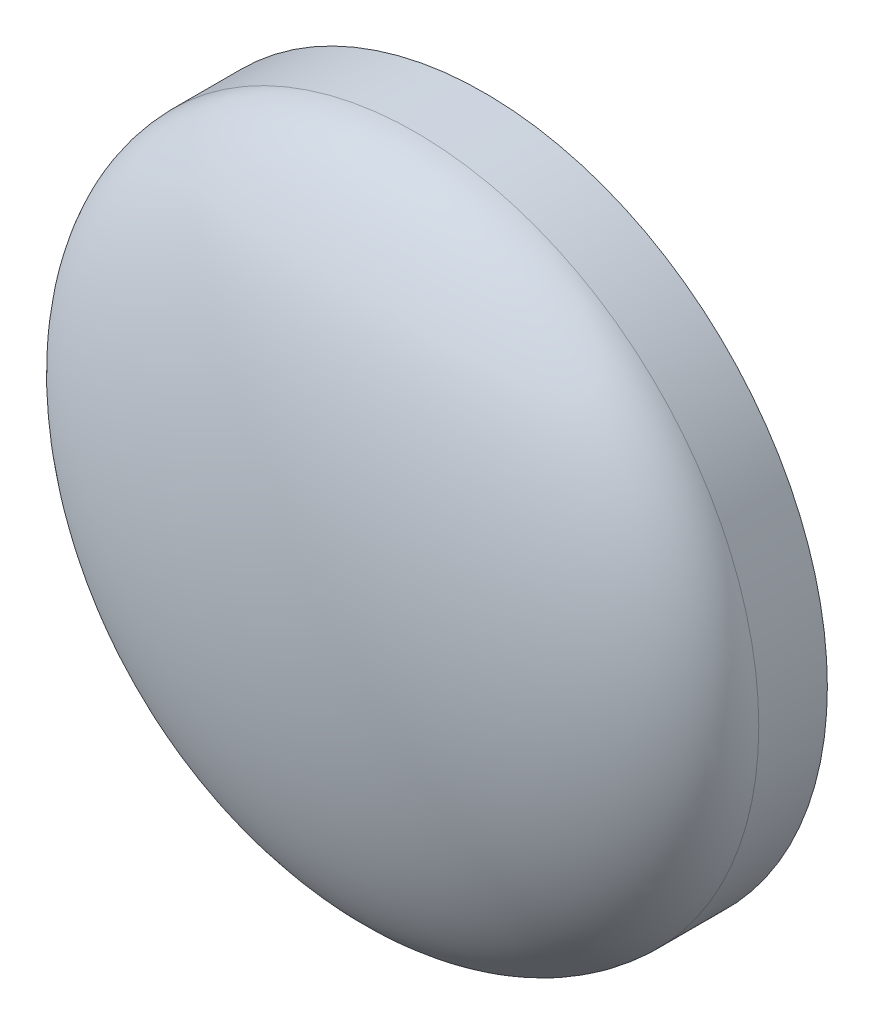
ISO-10303-21;
HEADER;
FILE_DESCRIPTION(('STEP AP214'),'2;1');
FILE_NAME('part.step','',(''),(''),'','','');
FILE_SCHEMA(('AUTOMOTIVE_DESIGN { 1 0 10303 214 1 1 1 1 }'));
ENDSEC;
DATA;
#1=APPLICATION_CONTEXT('core data for automotive mechanical design processes');
#2=APPLICATION_PROTOCOL_DEFINITION('international standard','automotive_design',2000,#1);
#3=PRODUCT_CONTEXT('',#1,'mechanical');
#4=PRODUCT('Part','Part','',(#3));
#5=PRODUCT_RELATED_PRODUCT_CATEGORY('part','',(#4));
#6=PRODUCT_DEFINITION_FORMATION('','',#4);
#7=PRODUCT_DEFINITION_CONTEXT('part definition',#1,'design');
#8=PRODUCT_DEFINITION('design','',#6,#7);
#9=PRODUCT_DEFINITION_SHAPE('','',#8);
#10=(LENGTH_UNIT() NAMED_UNIT(*) SI_UNIT(.MILLI.,.METRE.));
#11=(NAMED_UNIT(*) PLANE_ANGLE_UNIT() SI_UNIT($,.RADIAN.));
#12=(NAMED_UNIT(*) SI_UNIT($,.STERADIAN.) SOLID_ANGLE_UNIT());
#13=UNCERTAINTY_MEASURE_WITH_UNIT(LENGTH_MEASURE(1.E-05),#10,'distance_accuracy_value','');
#14=(GEOMETRIC_REPRESENTATION_CONTEXT(3) GLOBAL_UNCERTAINTY_ASSIGNED_CONTEXT((#13)) GLOBAL_UNIT_ASSIGNED_CONTEXT((#10,
#11,#12)) REPRESENTATION_CONTEXT('',''));
#15=CARTESIAN_POINT('',(0.,0.,0.));
#16=DIRECTION('',(0.,0.,1.));
#17=DIRECTION('',(1.,0.,0.));
#18=AXIS2_PLACEMENT_3D('',#15,#16,#17);
#19=CARTESIAN_POINT('',(3.04657257930898,-1.45705645097387,5.));
#20=DIRECTION('',(0.,0.,-1.));
#21=DIRECTION('',(-1.,0.,0.));
#22=AXIS2_PLACEMENT_3D('',#19,#20,#21);
#23=CYLINDRICAL_SURFACE('',#22,25.);
#24=CARTESIAN_POINT('',(3.04657257930898,-1.45705645097387,5.));
#25=DIRECTION('',(0.,0.,1.));
#26=DIRECTION('',(1.,0.,0.));
#27=AXIS2_PLACEMENT_3D('',#24,#25,#26);
#28=CIRCLE('',#27,25.);
#29=CARTESIAN_POINT('',(28.046572579309,-1.45705645097387,5.));
#30=VERTEX_POINT('',#29);
#31=EDGE_CURVE('E11',#30,#30,#28,.T.);
#32=ORIENTED_EDGE('',*,*,#31,.F.);
#33=EDGE_LOOP('',(#32));
#34=FACE_BOUND('',#33,.T.);
#35=CARTESIAN_POINT('',(3.04657257930898,-1.45705645097387,0.));
#36=DIRECTION('',(0.,0.,1.));
#37=DIRECTION('',(1.,0.,0.));
#38=AXIS2_PLACEMENT_3D('',#35,#36,#37);
#39=CIRCLE('',#38,25.);
#40=CARTESIAN_POINT('',(28.046572579309,-1.45705645097387,0.));
#41=VERTEX_POINT('',#40);
#42=EDGE_CURVE('E44',#41,#41,#39,.T.);
#43=ORIENTED_EDGE('',*,*,#42,.T.);
#44=EDGE_LOOP('',(#43));
#45=FACE_BOUND('',#44,.T.);
#46=ADVANCED_FACE('F35',(#34,#45),#23,.T.);
#47=CARTESIAN_POINT('',(3.04657257930898,-1.45705645097387,5.));
#48=DIRECTION('',(0.,1.,0.));
#49=DIRECTION('',(1.,0.,0.));
#50=AXIS2_PLACEMENT_3D('',#47,#48,#49);
#51=ELLIPSE('',#50,25.,10.);
#52=TRIMMED_CURVE('',#51,(PARAMETER_VALUE(4.71238898038469)),
(PARAMETER_VALUE(7.85398163397448)),.T.,.PARAMETER.);
#53=CARTESIAN_POINT('',(3.04657257930898,-1.45705645097387,-5.));
#54=DIRECTION('',(0.,0.,1.));
#55=AXIS1_PLACEMENT('',#53,#54);
#56=SURFACE_OF_REVOLUTION('',#52,#55);
#57=CARTESIAN_POINT('',(3.04657257930897,-1.45705645097387,15.));
#58=VERTEX_POINT('',#57);
#59=VERTEX_LOOP('',#58);
#60=FACE_BOUND('',#59,.T.);
#61=ORIENTED_EDGE('',*,*,#31,.T.);
#62=EDGE_LOOP('',(#61));
#63=FACE_BOUND('',#62,.T.);
#64=ADVANCED_FACE('F37',(#60,#63),#56,.F.);
#65=CARTESIAN_POINT('',(0.,0.,0.));
#66=DIRECTION('',(0.,0.,1.));
#67=DIRECTION('',(1.,0.,0.));
#68=AXIS2_PLACEMENT_3D('',#65,#66,#67);
#69=PLANE('',#68);
#70=CARTESIAN_POINT('',(3.04657257930898,-1.45705645097387,0.));
#71=DIRECTION('',(0.,0.,1.));
#72=DIRECTION('',(1.,0.,0.));
#73=AXIS2_PLACEMENT_3D('',#70,#71,#72);
#74=CIRCLE('',#73,12.5);
#75=CARTESIAN_POINT('',(15.0712936324435,-4.87115715164202,0.));
#76=VERTEX_POINT('',#75);
#77=CARTESIAN_POINT('',(13.5110028403928,-8.29413911179588,0.));
#78=VERTEX_POINT('',#77);
#79=EDGE_CURVE('E117',#76,#78,#74,.T.);
#80=ORIENTED_EDGE('',*,*,#79,.T.);
#81=CARTESIAN_POINT('',(13.6784337245702,-8.40353243436902,0.));
#82=DIRECTION('',(0.,0.,1.));
#83=DIRECTION('',(1.,0.,0.));
#84=AXIS2_PLACEMENT_3D('',#81,#82,#83);
#85=CIRCLE('',#84,0.2);
#86=CARTESIAN_POINT('',(13.7634029171983,-8.22247930320546,0.));
#87=VERTEX_POINT('',#86);
#88=EDGE_CURVE('E54',#87,#78,#85,.T.);
#89=ORIENTED_EDGE('',*,*,#88,.F.);
#90=DIRECTION('',(-0.905265655817804,0.424845963140478,0.));
#91=VECTOR('',#90,1.);
#92=CARTESIAN_POINT('',(-0.678139954991644,-1.44498680546195,0.));
#93=LINE('',#92,#91);
#94=CARTESIAN_POINT('',(17.087320204919,-9.782411277235,0.));
#95=VERTEX_POINT('',#94);
#96=EDGE_CURVE('E108',#95,#87,#93,.T.);
#97=ORIENTED_EDGE('',*,*,#96,.F.);
#98=CARTESIAN_POINT('',(17.2997431864892,-9.3297784493261,0.));
#99=DIRECTION('',(0.,0.,1.));
#100=DIRECTION('',(1.,0.,0.));
#101=AXIS2_PLACEMENT_3D('',#98,#99,#100);
#102=CIRCLE('',#101,0.499999999999996);
#103=CARTESIAN_POINT('',(17.7374163346552,-9.57152669725053,0.));
#104=VERTEX_POINT('',#103);
#105=EDGE_CURVE('E138',#95,#104,#102,.T.);
#106=ORIENTED_EDGE('',*,*,#105,.T.);
#107=CARTESIAN_POINT('',(3.04657257930898,-1.45705645097387,0.));
#108=DIRECTION('',(0.,0.,1.));
#109=DIRECTION('',(1.,0.,0.));
#110=AXIS2_PLACEMENT_3D('',#107,#108,#109);
#111=CIRCLE('',#110,16.7828936009766);
#112=CARTESIAN_POINT('',(18.793687385888,-7.26170053051246,0.));
#113=VERTEX_POINT('',#112);
#114=EDGE_CURVE('E141',#113,#104,#111,.F.);
#115=ORIENTED_EDGE('',*,*,#114,.F.);
#116=CARTESIAN_POINT('',(18.3245455566845,-7.08876717892401,0.));
#117=DIRECTION('',(0.,0.,1.));
#118=DIRECTION('',(1.,0.,0.));
#119=AXIS2_PLACEMENT_3D('',#116,#117,#118);
#120=CIRCLE('',#119,0.499999999999998);
#121=CARTESIAN_POINT('',(18.5317581742175,-6.63372549826705,0.));
#122=VERTEX_POINT('',#121);
#123=EDGE_CURVE('E144',#113,#122,#120,.T.);
#124=ORIENTED_EDGE('',*,*,#123,.T.);
#125=DIRECTION('',(-0.910083361313929,0.414425235066037,0.));
#126=VECTOR('',#125,1.);
#127=CARTESIAN_POINT('',(0.680811575552799,1.4950713293359,0.));
#128=LINE('',#127,#126);
#129=CARTESIAN_POINT('',(15.1808041222805,-5.10779943511549,0.));
#130=VERTEX_POINT('',#129);
#131=EDGE_CURVE('E147',#122,#130,#128,.T.);
#132=ORIENTED_EDGE('',*,*,#131,.T.);
#133=CARTESIAN_POINT('',(15.2636891692937,-4.9257827628527,0.));
#134=DIRECTION('',(0.,0.,1.));
#135=DIRECTION('',(1.,0.,0.));
#136=AXIS2_PLACEMENT_3D('',#133,#134,#135);
#137=CIRCLE('',#136,0.200000000000001);
#138=EDGE_CURVE('E150',#130,#76,#137,.F.);
#139=ORIENTED_EDGE('',*,*,#138,.T.);
#140=EDGE_LOOP('',(#80,#89,#97,#106,#115,#124,#132,#139));
#141=FACE_BOUND('',#140,.T.);
#142=ORIENTED_EDGE('',*,*,#42,.F.);
#143=EDGE_LOOP('',(#142));
#144=FACE_BOUND('',#143,.T.);
#145=ADVANCED_FACE('F171',(#141,#144),#69,.F.);
#146=CARTESIAN_POINT('',(13.6784337245702,-8.40353243436902,3.));
#147=DIRECTION('',(0.,0.,-1.));
#148=DIRECTION('',(-1.,0.,0.));
#149=AXIS2_PLACEMENT_3D('',#146,#147,#148);
#150=CYLINDRICAL_SURFACE('',#149,0.2);
#151=ORIENTED_EDGE('',*,*,#88,.T.);
#152=DIRECTION('',(0.,0.,-1.));
#153=VECTOR('',#152,1.);
#154=CARTESIAN_POINT('',(13.5110028403928,-8.29413911179588,3.));
#155=LINE('',#154,#153);
#156=CARTESIAN_POINT('',(13.5110028403928,-8.29413911179588,3.));
#157=VERTEX_POINT('',#156);
#158=EDGE_CURVE('E114',#157,#78,#155,.T.);
#159=ORIENTED_EDGE('',*,*,#158,.F.);
#160=CARTESIAN_POINT('',(13.6784337245702,-8.40353243436902,3.));
#161=DIRECTION('',(0.,0.,1.));
#162=DIRECTION('',(1.,0.,0.));
#163=AXIS2_PLACEMENT_3D('',#160,#161,#162);
#164=CIRCLE('',#163,0.2);
#165=CARTESIAN_POINT('',(13.7634029171983,-8.22247930320546,3.));
#166=VERTEX_POINT('',#165);
#167=EDGE_CURVE('E112',#166,#157,#164,.T.);
#168=ORIENTED_EDGE('',*,*,#167,.F.);
#169=DIRECTION('',(0.,0.,-1.));
#170=VECTOR('',#169,1.);
#171=CARTESIAN_POINT('',(13.7634029171983,-8.22247930320546,3.));
#172=LINE('',#171,#170);
#173=EDGE_CURVE('E102',#166,#87,#172,.T.);
#174=ORIENTED_EDGE('',*,*,#173,.T.);
#175=EDGE_LOOP('',(#151,#159,#168,#174));
#176=FACE_BOUND('',#175,.T.);
#177=ADVANCED_FACE('F113',(#176),#150,.T.);
#178=CARTESIAN_POINT('',(-0.678139954991644,-1.44498680546195,3.));
#179=DIRECTION('',(-0.424845963140478,-0.905265655817804,0.));
#180=DIRECTION('',(0.905265655817804,-0.424845963140478,0.));
#181=AXIS2_PLACEMENT_3D('',#178,#179,#180);
#182=PLANE('',#181);
#183=ORIENTED_EDGE('',*,*,#96,.T.);
#184=ORIENTED_EDGE('',*,*,#173,.F.);
#185=DIRECTION('',(-0.905265655817804,0.424845963140478,0.));
#186=VECTOR('',#185,1.);
#187=CARTESIAN_POINT('',(-0.678139954991644,-1.44498680546195,3.));
#188=LINE('',#187,#186);
#189=CARTESIAN_POINT('',(17.087320204919,-9.782411277235,3.));
#190=VERTEX_POINT('',#189);
#191=EDGE_CURVE('E106',#190,#166,#188,.T.);
#192=ORIENTED_EDGE('',*,*,#191,.F.);
#193=DIRECTION('',(0.,0.,-1.));
#194=VECTOR('',#193,1.);
#195=CARTESIAN_POINT('',(17.087320204919,-9.782411277235,3.));
#196=LINE('',#195,#194);
#197=EDGE_CURVE('E109',#190,#95,#196,.T.);
#198=ORIENTED_EDGE('',*,*,#197,.T.);
#199=EDGE_LOOP('',(#183,#184,#192,#198));
#200=FACE_BOUND('',#199,.T.);
#201=ADVANCED_FACE('F104',(#200),#182,.F.);
#202=CARTESIAN_POINT('',(17.2997431864892,-9.3297784493261,3.));
#203=DIRECTION('',(0.,0.,-1.));
#204=DIRECTION('',(-1.,0.,0.));
#205=AXIS2_PLACEMENT_3D('',#202,#203,#204);
#206=CYLINDRICAL_SURFACE('',#205,0.499999999999996);
#207=ORIENTED_EDGE('',*,*,#105,.F.);
#208=ORIENTED_EDGE('',*,*,#197,.F.);
#209=CARTESIAN_POINT('',(17.2997431864892,-9.3297784493261,3.));
#210=DIRECTION('',(0.,0.,1.));
#211=DIRECTION('',(1.,0.,0.));
#212=AXIS2_PLACEMENT_3D('',#209,#210,#211);
#213=CIRCLE('',#212,0.499999999999996);
#214=CARTESIAN_POINT('',(17.7374163346552,-9.57152669725053,3.));
#215=VERTEX_POINT('',#214);
#216=EDGE_CURVE('E122',#190,#215,#213,.T.);
#217=ORIENTED_EDGE('',*,*,#216,.T.);
#218=DIRECTION('',(0.,0.,-1.));
#219=VECTOR('',#218,1.);
#220=CARTESIAN_POINT('',(17.7374163346552,-9.57152669725053,3.));
#221=LINE('',#220,#219);
#222=EDGE_CURVE('E164',#215,#104,#221,.T.);
#223=ORIENTED_EDGE('',*,*,#222,.T.);
#224=EDGE_LOOP('',(#207,#208,#217,#223));
#225=FACE_BOUND('',#224,.T.);
#226=ADVANCED_FACE('F244',(#225),#206,.F.);
#227=CARTESIAN_POINT('',(3.04657257930898,-1.45705645097387,3.));
#228=DIRECTION('',(0.,0.,-1.));
#229=DIRECTION('',(-1.,0.,0.));
#230=AXIS2_PLACEMENT_3D('',#227,#228,#229);
#231=CYLINDRICAL_SURFACE('',#230,16.7828936009766);
#232=ORIENTED_EDGE('',*,*,#114,.T.);
#233=ORIENTED_EDGE('',*,*,#222,.F.);
#234=CARTESIAN_POINT('',(3.04657257930898,-1.45705645097387,3.));
#235=DIRECTION('',(0.,0.,1.));
#236=DIRECTION('',(1.,0.,0.));
#237=AXIS2_PLACEMENT_3D('',#234,#235,#236);
#238=CIRCLE('',#237,16.7828936009766);
#239=CARTESIAN_POINT('',(18.793687385888,-7.26170053051246,3.));
#240=VERTEX_POINT('',#239);
#241=EDGE_CURVE('E124',#240,#215,#238,.F.);
#242=ORIENTED_EDGE('',*,*,#241,.F.);
#243=DIRECTION('',(0.,0.,-1.));
#244=VECTOR('',#243,1.);
#245=CARTESIAN_POINT('',(18.793687385888,-7.26170053051246,3.));
#246=LINE('',#245,#244);
#247=EDGE_CURVE('E162',#240,#113,#246,.T.);
#248=ORIENTED_EDGE('',*,*,#247,.T.);
#249=EDGE_LOOP('',(#232,#233,#242,#248));
#250=FACE_BOUND('',#249,.T.);
#251=ADVANCED_FACE('F235',(#250),#231,.F.);
#252=CARTESIAN_POINT('',(18.3245455566845,-7.08876717892401,3.));
#253=DIRECTION('',(0.,0.,-1.));
#254=DIRECTION('',(-1.,0.,0.));
#255=AXIS2_PLACEMENT_3D('',#252,#253,#254);
#256=CYLINDRICAL_SURFACE('',#255,0.499999999999998);
#257=ORIENTED_EDGE('',*,*,#123,.F.);
#258=ORIENTED_EDGE('',*,*,#247,.F.);
#259=CARTESIAN_POINT('',(18.3245455566845,-7.08876717892401,3.));
#260=DIRECTION('',(0.,0.,1.));
#261=DIRECTION('',(1.,0.,0.));
#262=AXIS2_PLACEMENT_3D('',#259,#260,#261);
#263=CIRCLE('',#262,0.499999999999998);
#264=CARTESIAN_POINT('',(18.5317581742175,-6.63372549826705,3.));
#265=VERTEX_POINT('',#264);
#266=EDGE_CURVE('E128',#240,#265,#263,.T.);
#267=ORIENTED_EDGE('',*,*,#266,.T.);
#268=DIRECTION('',(0.,0.,-1.));
#269=VECTOR('',#268,1.);
#270=CARTESIAN_POINT('',(18.5317581742175,-6.63372549826705,3.));
#271=LINE('',#270,#269);
#272=EDGE_CURVE('E160',#265,#122,#271,.T.);
#273=ORIENTED_EDGE('',*,*,#272,.T.);
#274=EDGE_LOOP('',(#257,#258,#267,#273));
#275=FACE_BOUND('',#274,.T.);
#276=ADVANCED_FACE('F226',(#275),#256,.F.);
#277=CARTESIAN_POINT('',(0.680811575552799,1.4950713293359,3.));
#278=DIRECTION('',(-0.414425235066037,-0.910083361313929,0.));
#279=DIRECTION('',(0.91008336131393,-0.414425235066037,0.));
#280=AXIS2_PLACEMENT_3D('',#277,#278,#279);
#281=PLANE('',#280);
#282=ORIENTED_EDGE('',*,*,#131,.F.);
#283=ORIENTED_EDGE('',*,*,#272,.F.);
#284=DIRECTION('',(-0.910083361313929,0.414425235066037,0.));
#285=VECTOR('',#284,1.);
#286=CARTESIAN_POINT('',(0.680811575552799,1.4950713293359,3.));
#287=LINE('',#286,#285);
#288=CARTESIAN_POINT('',(15.1808041222805,-5.10779943511549,3.));
#289=VERTEX_POINT('',#288);
#290=EDGE_CURVE('E130',#265,#289,#287,.T.);
#291=ORIENTED_EDGE('',*,*,#290,.T.);
#292=DIRECTION('',(0.,0.,-1.));
#293=VECTOR('',#292,1.);
#294=CARTESIAN_POINT('',(15.1808041222805,-5.10779943511549,3.));
#295=LINE('',#294,#293);
#296=EDGE_CURVE('E158',#289,#130,#295,.T.);
#297=ORIENTED_EDGE('',*,*,#296,.T.);
#298=EDGE_LOOP('',(#282,#283,#291,#297));
#299=FACE_BOUND('',#298,.T.);
#300=ADVANCED_FACE('F217',(#299),#281,.T.);
#301=CARTESIAN_POINT('',(15.2636891692937,-4.9257827628527,3.));
#302=DIRECTION('',(0.,0.,-1.));
#303=DIRECTION('',(-1.,0.,0.));
#304=AXIS2_PLACEMENT_3D('',#301,#302,#303);
#305=CYLINDRICAL_SURFACE('',#304,0.200000000000001);
#306=ORIENTED_EDGE('',*,*,#138,.F.);
#307=ORIENTED_EDGE('',*,*,#296,.F.);
#308=CARTESIAN_POINT('',(15.2636891692937,-4.9257827628527,3.));
#309=DIRECTION('',(0.,0.,1.));
#310=DIRECTION('',(1.,0.,0.));
#311=AXIS2_PLACEMENT_3D('',#308,#309,#310);
#312=CIRCLE('',#311,0.200000000000001);
#313=CARTESIAN_POINT('',(15.0712936324435,-4.87115715164202,3.));
#314=VERTEX_POINT('',#313);
#315=EDGE_CURVE('E132',#289,#314,#312,.F.);
#316=ORIENTED_EDGE('',*,*,#315,.T.);
#317=DIRECTION('',(0.,0.,-1.));
#318=VECTOR('',#317,1.);
#319=CARTESIAN_POINT('',(15.0712936324435,-4.87115715164202,3.));
#320=LINE('',#319,#318);
#321=EDGE_CURVE('E156',#314,#76,#320,.T.);
#322=ORIENTED_EDGE('',*,*,#321,.T.);
#323=EDGE_LOOP('',(#306,#307,#316,#322));
#324=FACE_BOUND('',#323,.T.);
#325=ADVANCED_FACE('F208',(#324),#305,.T.);
#326=CARTESIAN_POINT('',(3.04657257930898,-1.45705645097387,3.));
#327=DIRECTION('',(0.,0.,-1.));
#328=DIRECTION('',(-1.,0.,0.));
#329=AXIS2_PLACEMENT_3D('',#326,#327,#328);
#330=CYLINDRICAL_SURFACE('',#329,12.5);
#331=ORIENTED_EDGE('',*,*,#79,.F.);
#332=ORIENTED_EDGE('',*,*,#321,.F.);
#333=CARTESIAN_POINT('',(3.04657257930898,-1.45705645097387,3.));
#334=DIRECTION('',(0.,0.,1.));
#335=DIRECTION('',(1.,0.,0.));
#336=AXIS2_PLACEMENT_3D('',#333,#334,#335);
#337=CIRCLE('',#336,12.5);
#338=EDGE_CURVE('E134',#314,#157,#337,.T.);
#339=ORIENTED_EDGE('',*,*,#338,.T.);
#340=ORIENTED_EDGE('',*,*,#158,.T.);
#341=EDGE_LOOP('',(#331,#332,#339,#340));
#342=FACE_BOUND('',#341,.T.);
#343=ADVANCED_FACE('F200',(#342),#330,.F.);
#344=CARTESIAN_POINT('',(0.,0.,3.));
#345=DIRECTION('',(0.,0.,1.));
#346=DIRECTION('',(1.,0.,0.));
#347=AXIS2_PLACEMENT_3D('',#344,#345,#346);
#348=PLANE('',#347);
#349=ORIENTED_EDGE('',*,*,#167,.T.);
#350=ORIENTED_EDGE('',*,*,#338,.F.);
#351=ORIENTED_EDGE('',*,*,#315,.F.);
#352=ORIENTED_EDGE('',*,*,#290,.F.);
#353=ORIENTED_EDGE('',*,*,#266,.F.);
#354=ORIENTED_EDGE('',*,*,#241,.T.);
#355=ORIENTED_EDGE('',*,*,#216,.F.);
#356=ORIENTED_EDGE('',*,*,#191,.T.);
#357=EDGE_LOOP('',(#349,#350,#351,#352,#353,#354,#355,#356));
#358=FACE_BOUND('',#357,.T.);
#359=ADVANCED_FACE('F120',(#358),#348,.F.);
#360=CLOSED_SHELL('',(#46,#64,#145,#177,#201,#226,#251,#276,#300,#325,#343,#359));
#361=MANIFOLD_SOLID_BREP('B2',#360);
#362=ADVANCED_BREP_SHAPE_REPRESENTATION('',(#18,#361),#14);
#363=SHAPE_DEFINITION_REPRESENTATION(#9,#362);
ENDSEC;
END-ISO-10303-21;
